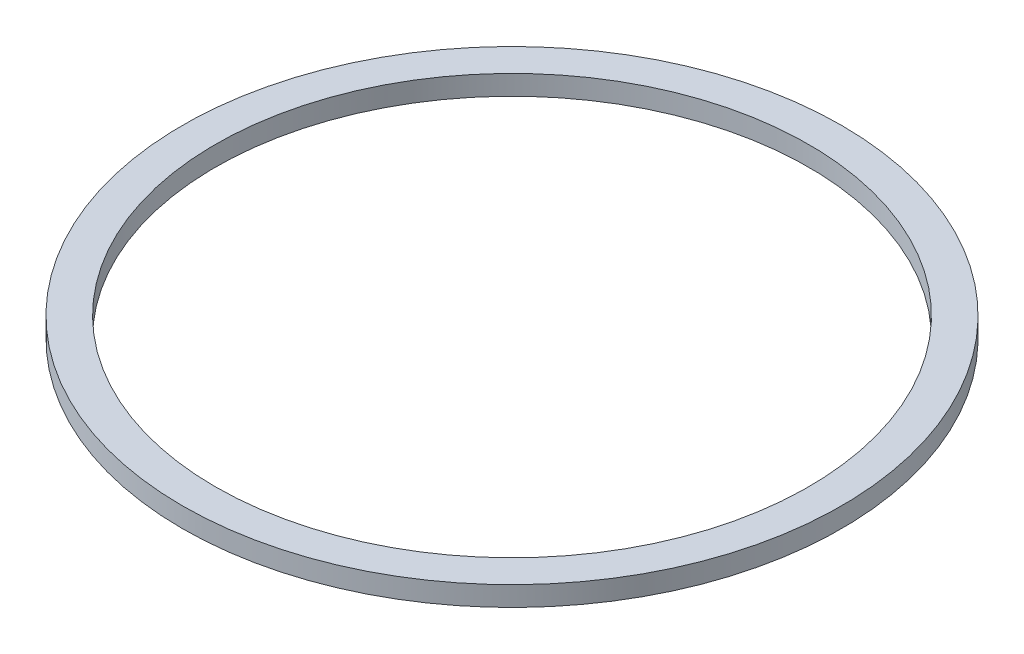
ISO-10303-21;
HEADER;
FILE_DESCRIPTION(('STEP AP214'),'2;1');
FILE_NAME('part.step','',(''),(''),'','','');
FILE_SCHEMA(('AUTOMOTIVE_DESIGN { 1 0 10303 214 1 1 1 1 }'));
ENDSEC;
DATA;
#1=APPLICATION_CONTEXT('core data for automotive mechanical design processes');
#2=APPLICATION_PROTOCOL_DEFINITION('international standard','automotive_design',2000,#1);
#3=PRODUCT_CONTEXT('',#1,'mechanical');
#4=PRODUCT('Part','Part','',(#3));
#5=PRODUCT_RELATED_PRODUCT_CATEGORY('part','',(#4));
#6=PRODUCT_DEFINITION_FORMATION('','',#4);
#7=PRODUCT_DEFINITION_CONTEXT('part definition',#1,'design');
#8=PRODUCT_DEFINITION('design','',#6,#7);
#9=PRODUCT_DEFINITION_SHAPE('','',#8);
#10=(LENGTH_UNIT() NAMED_UNIT(*) SI_UNIT(.MILLI.,.METRE.));
#11=(NAMED_UNIT(*) PLANE_ANGLE_UNIT() SI_UNIT($,.RADIAN.));
#12=(NAMED_UNIT(*) SI_UNIT($,.STERADIAN.) SOLID_ANGLE_UNIT());
#13=UNCERTAINTY_MEASURE_WITH_UNIT(LENGTH_MEASURE(1.E-05),#10,'distance_accuracy_value','');
#14=(GEOMETRIC_REPRESENTATION_CONTEXT(3) GLOBAL_UNCERTAINTY_ASSIGNED_CONTEXT((#13)) GLOBAL_UNIT_ASSIGNED_CONTEXT((#10,
#11,#12)) REPRESENTATION_CONTEXT('',''));
#15=CARTESIAN_POINT('',(0.,0.,0.));
#16=DIRECTION('',(0.,0.,1.));
#17=DIRECTION('',(1.,0.,0.));
#18=AXIS2_PLACEMENT_3D('',#15,#16,#17);
#19=CARTESIAN_POINT('',(0.,3.,0.));
#20=DIRECTION('',(0.,1.,0.));
#21=DIRECTION('',(0.,0.,1.));
#22=AXIS2_PLACEMENT_3D('',#19,#20,#21);
#23=PLANE('',#22);
#24=CARTESIAN_POINT('',(0.,3.,0.));
#25=DIRECTION('',(0.,1.,0.));
#26=DIRECTION('',(0.,0.,1.));
#27=AXIS2_PLACEMENT_3D('',#24,#25,#26);
#28=CIRCLE('',#27,50.);
#29=CARTESIAN_POINT('',(0.,3.,50.));
#30=VERTEX_POINT('',#29);
#31=EDGE_CURVE('E10',#30,#30,#28,.T.);
#32=ORIENTED_EDGE('',*,*,#31,.T.);
#33=EDGE_LOOP('',(#32));
#34=FACE_BOUND('',#33,.T.);
#35=CARTESIAN_POINT('',(0.,3.,0.));
#36=DIRECTION('',(0.,1.,0.));
#37=DIRECTION('',(0.,0.,1.));
#38=AXIS2_PLACEMENT_3D('',#35,#36,#37);
#39=CIRCLE('',#38,45.);
#40=CARTESIAN_POINT('',(0.,3.,45.));
#41=VERTEX_POINT('',#40);
#42=EDGE_CURVE('E46',#41,#41,#39,.T.);
#43=ORIENTED_EDGE('',*,*,#42,.F.);
#44=EDGE_LOOP('',(#43));
#45=FACE_BOUND('',#44,.T.);
#46=ADVANCED_FACE('F35',(#34,#45),#23,.T.);
#47=CARTESIAN_POINT('',(0.,0.,0.));
#48=DIRECTION('',(0.,1.,0.));
#49=DIRECTION('',(0.,0.,1.));
#50=AXIS2_PLACEMENT_3D('',#47,#48,#49);
#51=PLANE('',#50);
#52=CARTESIAN_POINT('',(0.,0.,0.));
#53=DIRECTION('',(0.,1.,0.));
#54=DIRECTION('',(0.,0.,1.));
#55=AXIS2_PLACEMENT_3D('',#52,#53,#54);
#56=CIRCLE('',#55,50.);
#57=CARTESIAN_POINT('',(0.,0.,50.));
#58=VERTEX_POINT('',#57);
#59=EDGE_CURVE('E39',#58,#58,#56,.T.);
#60=ORIENTED_EDGE('',*,*,#59,.F.);
#61=EDGE_LOOP('',(#60));
#62=FACE_BOUND('',#61,.T.);
#63=CARTESIAN_POINT('',(0.,0.,0.));
#64=DIRECTION('',(0.,1.,0.));
#65=DIRECTION('',(0.,0.,1.));
#66=AXIS2_PLACEMENT_3D('',#63,#64,#65);
#67=CIRCLE('',#66,45.);
#68=CARTESIAN_POINT('',(0.,0.,45.));
#69=VERTEX_POINT('',#68);
#70=EDGE_CURVE('E48',#69,#69,#67,.T.);
#71=ORIENTED_EDGE('',*,*,#70,.T.);
#72=EDGE_LOOP('',(#71));
#73=FACE_BOUND('',#72,.T.);
#74=ADVANCED_FACE('F58',(#62,#73),#51,.F.);
#75=CARTESIAN_POINT('',(0.,3.,0.));
#76=DIRECTION('',(0.,-1.,0.));
#77=DIRECTION('',(0.,0.,-1.));
#78=AXIS2_PLACEMENT_3D('',#75,#76,#77);
#79=CYLINDRICAL_SURFACE('',#78,50.);
#80=ORIENTED_EDGE('',*,*,#31,.F.);
#81=EDGE_LOOP('',(#80));
#82=FACE_BOUND('',#81,.T.);
#83=ORIENTED_EDGE('',*,*,#59,.T.);
#84=EDGE_LOOP('',(#83));
#85=FACE_BOUND('',#84,.T.);
#86=ADVANCED_FACE('F37',(#82,#85),#79,.T.);
#87=CARTESIAN_POINT('',(0.,3.,0.));
#88=DIRECTION('',(0.,-1.,0.));
#89=DIRECTION('',(0.,0.,-1.));
#90=AXIS2_PLACEMENT_3D('',#87,#88,#89);
#91=CYLINDRICAL_SURFACE('',#90,45.);
#92=ORIENTED_EDGE('',*,*,#42,.T.);
#93=EDGE_LOOP('',(#92));
#94=FACE_BOUND('',#93,.T.);
#95=ORIENTED_EDGE('',*,*,#70,.F.);
#96=EDGE_LOOP('',(#95));
#97=FACE_BOUND('',#96,.T.);
#98=ADVANCED_FACE('F54',(#94,#97),#91,.F.);
#99=CLOSED_SHELL('',(#46,#74,#86,#98));
#100=MANIFOLD_SOLID_BREP('B2',#99);
#101=ADVANCED_BREP_SHAPE_REPRESENTATION('',(#18,#100),#14);
#102=SHAPE_DEFINITION_REPRESENTATION(#9,#101);
ENDSEC;
END-ISO-10303-21;
